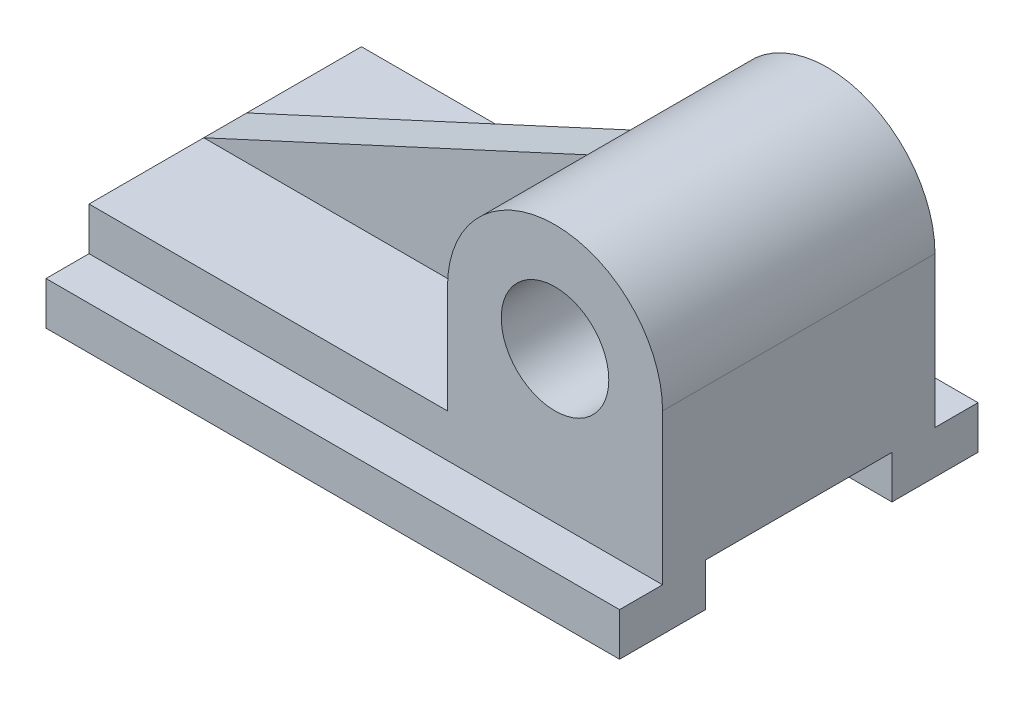
ISO-10303-21;
HEADER;
FILE_DESCRIPTION(('STEP AP214'),'2;1');
FILE_NAME('part.step','',(''),(''),'','','');
FILE_SCHEMA(('AUTOMOTIVE_DESIGN { 1 0 10303 214 1 1 1 1 }'));
ENDSEC;
DATA;
#1=APPLICATION_CONTEXT('core data for automotive mechanical design processes');
#2=APPLICATION_PROTOCOL_DEFINITION('international standard','automotive_design',2000,#1);
#3=PRODUCT_CONTEXT('',#1,'mechanical');
#4=PRODUCT('Part','Part','',(#3));
#5=PRODUCT_RELATED_PRODUCT_CATEGORY('part','',(#4));
#6=PRODUCT_DEFINITION_FORMATION('','',#4);
#7=PRODUCT_DEFINITION_CONTEXT('part definition',#1,'design');
#8=PRODUCT_DEFINITION('design','',#6,#7);
#9=PRODUCT_DEFINITION_SHAPE('','',#8);
#10=(LENGTH_UNIT() NAMED_UNIT(*) SI_UNIT(.MILLI.,.METRE.));
#11=(NAMED_UNIT(*) PLANE_ANGLE_UNIT() SI_UNIT($,.RADIAN.));
#12=(NAMED_UNIT(*) SI_UNIT($,.STERADIAN.) SOLID_ANGLE_UNIT());
#13=UNCERTAINTY_MEASURE_WITH_UNIT(LENGTH_MEASURE(1.E-05),#10,'distance_accuracy_value','');
#14=(GEOMETRIC_REPRESENTATION_CONTEXT(3) GLOBAL_UNCERTAINTY_ASSIGNED_CONTEXT((#13)) GLOBAL_UNIT_ASSIGNED_CONTEXT((#10,
#11,#12)) REPRESENTATION_CONTEXT('',''));
#15=CARTESIAN_POINT('',(0.,0.,0.));
#16=DIRECTION('',(0.,0.,1.));
#17=DIRECTION('',(1.,0.,0.));
#18=AXIS2_PLACEMENT_3D('',#15,#16,#17);
#19=CARTESIAN_POINT('',(-30.,0.,76.));
#20=DIRECTION('',(1.,0.,0.));
#21=DIRECTION('',(0.,1.,0.));
#22=AXIS2_PLACEMENT_3D('',#19,#20,#21);
#23=PLANE('',#22);
#24=DIRECTION('',(0.,-1.,0.));
#25=VECTOR('',#24,1.);
#26=CARTESIAN_POINT('',(-30.,0.,32.));
#27=LINE('',#26,#25);
#28=CARTESIAN_POINT('',(-30.,0.,32.));
#29=VERTEX_POINT('',#28);
#30=CARTESIAN_POINT('',(-30.,-30.,32.));
#31=VERTEX_POINT('',#30);
#32=EDGE_CURVE('E188',#29,#31,#27,.T.);
#33=ORIENTED_EDGE('',*,*,#32,.F.);
#34=DIRECTION('',(0.,0.,-1.));
#35=VECTOR('',#34,1.);
#36=CARTESIAN_POINT('',(-30.,0.,76.));
#37=LINE('',#36,#35);
#38=CARTESIAN_POINT('',(-30.,0.,0.));
#39=VERTEX_POINT('',#38);
#40=EDGE_CURVE('E48',#29,#39,#37,.T.);
#41=ORIENTED_EDGE('',*,*,#40,.T.);
#42=DIRECTION('',(0.,-1.,0.));
#43=VECTOR('',#42,1.);
#44=CARTESIAN_POINT('',(-30.,0.,0.));
#45=LINE('',#44,#43);
#46=CARTESIAN_POINT('',(-30.,-30.,0.));
#47=VERTEX_POINT('',#46);
#48=EDGE_CURVE('E322',#39,#47,#45,.T.);
#49=ORIENTED_EDGE('',*,*,#48,.T.);
#50=DIRECTION('',(0.,0.,-1.));
#51=VECTOR('',#50,1.);
#52=CARTESIAN_POINT('',(-30.,-30.,76.));
#53=LINE('',#52,#51);
#54=EDGE_CURVE('E353',#31,#47,#53,.T.);
#55=ORIENTED_EDGE('',*,*,#54,.F.);
#56=EDGE_LOOP('',(#33,#41,#49,#55));
#57=FACE_BOUND('',#56,.T.);
#58=ADVANCED_FACE('F39',(#57),#23,.F.);
#59=CARTESIAN_POINT('',(-30.,-30.,76.));
#60=DIRECTION('',(0.,-1.,0.));
#61=DIRECTION('',(0.,0.,-1.));
#62=AXIS2_PLACEMENT_3D('',#59,#60,#61);
#63=PLANE('',#62);
#64=DIRECTION('',(-1.,0.,0.));
#65=VECTOR('',#64,1.);
#66=CARTESIAN_POINT('',(-30.,-30.,32.));
#67=LINE('',#66,#65);
#68=CARTESIAN_POINT('',(-130.,-30.,32.));
#69=VERTEX_POINT('',#68);
#70=EDGE_CURVE('E180',#31,#69,#67,.T.);
#71=ORIENTED_EDGE('',*,*,#70,.F.);
#72=ORIENTED_EDGE('',*,*,#54,.T.);
#73=DIRECTION('',(-1.,0.,0.));
#74=VECTOR('',#73,1.);
#75=CARTESIAN_POINT('',(-30.,-30.,0.));
#76=LINE('',#75,#74);
#77=CARTESIAN_POINT('',(-130.,-30.,0.));
#78=VERTEX_POINT('',#77);
#79=EDGE_CURVE('E326',#47,#78,#76,.T.);
#80=ORIENTED_EDGE('',*,*,#79,.T.);
#81=DIRECTION('',(0.,0.,-1.));
#82=VECTOR('',#81,1.);
#83=CARTESIAN_POINT('',(-130.,-30.,76.));
#84=LINE('',#83,#82);
#85=EDGE_CURVE('E349',#69,#78,#84,.T.);
#86=ORIENTED_EDGE('',*,*,#85,.F.);
#87=EDGE_LOOP('',(#71,#72,#80,#86));
#88=FACE_BOUND('',#87,.T.);
#89=ADVANCED_FACE('F365',(#88),#63,.F.);
#90=CARTESIAN_POINT('',(30.,-42.,76.));
#91=DIRECTION('',(0.,1.,0.));
#92=DIRECTION('',(-1.,0.,0.));
#93=AXIS2_PLACEMENT_3D('',#90,#91,#92);
#94=PLANE('',#93);
#95=DIRECTION('',(0.,0.,-1.));
#96=VECTOR('',#95,1.);
#97=CARTESIAN_POINT('',(-130.,-42.,76.));
#98=LINE('',#97,#96);
#99=CARTESIAN_POINT('',(-130.,-42.,64.));
#100=VERTEX_POINT('',#99);
#101=CARTESIAN_POINT('',(-130.,-42.,12.));
#102=VERTEX_POINT('',#101);
#103=EDGE_CURVE('E346',#100,#102,#98,.T.);
#104=ORIENTED_EDGE('',*,*,#103,.T.);
#105=DIRECTION('',(1.,0.,0.));
#106=VECTOR('',#105,1.);
#107=CARTESIAN_POINT('',(-130.,-42.,12.));
#108=LINE('',#107,#106);
#109=CARTESIAN_POINT('',(30.,-42.,12.));
#110=VERTEX_POINT('',#109);
#111=EDGE_CURVE('E210',#102,#110,#108,.T.);
#112=ORIENTED_EDGE('',*,*,#111,.T.);
#113=DIRECTION('',(0.,0.,-1.));
#114=VECTOR('',#113,1.);
#115=CARTESIAN_POINT('',(30.,-42.,76.));
#116=LINE('',#115,#114);
#117=CARTESIAN_POINT('',(30.,-42.,64.));
#118=VERTEX_POINT('',#117);
#119=EDGE_CURVE('E343',#118,#110,#116,.T.);
#120=ORIENTED_EDGE('',*,*,#119,.F.);
#121=DIRECTION('',(1.,0.,0.));
#122=VECTOR('',#121,1.);
#123=CARTESIAN_POINT('',(-130.,-42.,64.));
#124=LINE('',#123,#122);
#125=EDGE_CURVE('E63',#100,#118,#124,.T.);
#126=ORIENTED_EDGE('',*,*,#125,.F.);
#127=EDGE_LOOP('',(#104,#112,#120,#126));
#128=FACE_BOUND('',#127,.T.);
#129=ADVANCED_FACE('F415',(#128),#94,.F.);
#130=CARTESIAN_POINT('',(0.,0.,76.));
#131=DIRECTION('',(0.,0.,1.));
#132=DIRECTION('',(1.,0.,0.));
#133=AXIS2_PLACEMENT_3D('',#130,#131,#132);
#134=PLANE('',#133);
#135=CARTESIAN_POINT('',(0.,0.,76.));
#136=DIRECTION('',(0.,0.,1.));
#137=DIRECTION('',(1.,0.,0.));
#138=AXIS2_PLACEMENT_3D('',#135,#136,#137);
#139=CIRCLE('',#138,30.);
#140=CARTESIAN_POINT('',(30.,0.,76.));
#141=VERTEX_POINT('',#140);
#142=CARTESIAN_POINT('',(-30.,0.,76.));
#143=VERTEX_POINT('',#142);
#144=EDGE_CURVE('E299',#141,#143,#139,.T.);
#145=ORIENTED_EDGE('',*,*,#144,.T.);
#146=DIRECTION('',(0.,-1.,0.));
#147=VECTOR('',#146,1.);
#148=CARTESIAN_POINT('',(-30.,0.,76.));
#149=LINE('',#148,#147);
#150=CARTESIAN_POINT('',(-30.,-30.,76.));
#151=VERTEX_POINT('',#150);
#152=EDGE_CURVE('E303',#143,#151,#149,.T.);
#153=ORIENTED_EDGE('',*,*,#152,.T.);
#154=DIRECTION('',(-1.,0.,0.));
#155=VECTOR('',#154,1.);
#156=CARTESIAN_POINT('',(-30.,-30.,76.));
#157=LINE('',#156,#155);
#158=CARTESIAN_POINT('',(-130.,-30.,76.));
#159=VERTEX_POINT('',#158);
#160=EDGE_CURVE('E307',#151,#159,#157,.T.);
#161=ORIENTED_EDGE('',*,*,#160,.T.);
#162=DIRECTION('',(0.,-1.,0.));
#163=VECTOR('',#162,1.);
#164=CARTESIAN_POINT('',(-130.,-42.,76.));
#165=LINE('',#164,#163);
#166=CARTESIAN_POINT('',(-130.,-42.,76.));
#167=VERTEX_POINT('',#166);
#168=EDGE_CURVE('E310',#159,#167,#165,.T.);
#169=ORIENTED_EDGE('',*,*,#168,.T.);
#170=DIRECTION('',(1.,0.,0.));
#171=VECTOR('',#170,1.);
#172=CARTESIAN_POINT('',(30.,-42.,76.));
#173=LINE('',#172,#171);
#174=CARTESIAN_POINT('',(30.,-42.,76.));
#175=VERTEX_POINT('',#174);
#176=EDGE_CURVE('E313',#167,#175,#173,.T.);
#177=ORIENTED_EDGE('',*,*,#176,.T.);
#178=DIRECTION('',(0.,1.,0.));
#179=VECTOR('',#178,1.);
#180=CARTESIAN_POINT('',(30.,0.,76.));
#181=LINE('',#180,#179);
#182=EDGE_CURVE('E316',#175,#141,#181,.T.);
#183=ORIENTED_EDGE('',*,*,#182,.T.);
#184=EDGE_LOOP('',(#145,#153,#161,#169,#177,#183));
#185=FACE_BOUND('',#184,.T.);
#186=CARTESIAN_POINT('',(0.,0.,76.));
#187=DIRECTION('',(0.,0.,1.));
#188=DIRECTION('',(1.,0.,0.));
#189=AXIS2_PLACEMENT_3D('',#186,#187,#188);
#190=CIRCLE('',#189,15.);
#191=CARTESIAN_POINT('',(15.,0.,76.));
#192=VERTEX_POINT('',#191);
#193=EDGE_CURVE('E291',#192,#192,#190,.T.);
#194=ORIENTED_EDGE('',*,*,#193,.F.);
#195=EDGE_LOOP('',(#194));
#196=FACE_BOUND('',#195,.T.);
#197=ADVANCED_FACE('F391',(#185,#196),#134,.T.);
#198=CARTESIAN_POINT('',(0.,0.,0.));
#199=DIRECTION('',(0.,0.,1.));
#200=DIRECTION('',(1.,0.,0.));
#201=AXIS2_PLACEMENT_3D('',#198,#199,#200);
#202=PLANE('',#201);
#203=CARTESIAN_POINT('',(0.,0.,0.));
#204=DIRECTION('',(0.,0.,1.));
#205=DIRECTION('',(1.,0.,0.));
#206=AXIS2_PLACEMENT_3D('',#203,#204,#205);
#207=CIRCLE('',#206,30.);
#208=CARTESIAN_POINT('',(30.,0.,0.));
#209=VERTEX_POINT('',#208);
#210=EDGE_CURVE('E295',#209,#39,#207,.T.);
#211=ORIENTED_EDGE('',*,*,#210,.F.);
#212=DIRECTION('',(0.,1.,0.));
#213=VECTOR('',#212,1.);
#214=CARTESIAN_POINT('',(30.,0.,0.));
#215=LINE('',#214,#213);
#216=CARTESIAN_POINT('',(30.,-42.,0.));
#217=VERTEX_POINT('',#216);
#218=EDGE_CURVE('E304',#217,#209,#215,.T.);
#219=ORIENTED_EDGE('',*,*,#218,.F.);
#220=DIRECTION('',(1.,0.,0.));
#221=VECTOR('',#220,1.);
#222=CARTESIAN_POINT('',(30.,-42.,0.));
#223=LINE('',#222,#221);
#224=CARTESIAN_POINT('',(-130.,-42.,0.));
#225=VERTEX_POINT('',#224);
#226=EDGE_CURVE('E334',#225,#217,#223,.T.);
#227=ORIENTED_EDGE('',*,*,#226,.F.);
#228=DIRECTION('',(0.,-1.,0.));
#229=VECTOR('',#228,1.);
#230=CARTESIAN_POINT('',(-130.,-42.,0.));
#231=LINE('',#230,#229);
#232=EDGE_CURVE('E330',#78,#225,#231,.T.);
#233=ORIENTED_EDGE('',*,*,#232,.F.);
#234=ORIENTED_EDGE('',*,*,#79,.F.);
#235=ORIENTED_EDGE('',*,*,#48,.F.);
#236=EDGE_LOOP('',(#211,#219,#227,#233,#234,#235));
#237=FACE_BOUND('',#236,.T.);
#238=CARTESIAN_POINT('',(0.,0.,0.));
#239=DIRECTION('',(0.,0.,1.));
#240=DIRECTION('',(1.,0.,0.));
#241=AXIS2_PLACEMENT_3D('',#238,#239,#240);
#242=CIRCLE('',#241,15.);
#243=CARTESIAN_POINT('',(15.,0.,0.));
#244=VERTEX_POINT('',#243);
#245=EDGE_CURVE('E290',#244,#244,#242,.T.);
#246=ORIENTED_EDGE('',*,*,#245,.T.);
#247=EDGE_LOOP('',(#246));
#248=FACE_BOUND('',#247,.T.);
#249=ADVANCED_FACE('F372',(#237,#248),#202,.F.);
#250=CARTESIAN_POINT('',(0.,0.,76.));
#251=DIRECTION('',(0.,0.,-1.));
#252=DIRECTION('',(-1.,0.,0.));
#253=AXIS2_PLACEMENT_3D('',#250,#251,#252);
#254=CYLINDRICAL_SURFACE('',#253,30.);
#255=DIRECTION('',(0.,0.,-1.));
#256=VECTOR('',#255,1.);
#257=CARTESIAN_POINT('',(-22.8292682926829,19.4634146341463,76.));
#258=LINE('',#257,#256);
#259=CARTESIAN_POINT('',(-22.8292682926829,19.4634146341463,32.));
#260=VERTEX_POINT('',#259);
#261=CARTESIAN_POINT('',(-22.8292682926829,19.4634146341463,44.));
#262=VERTEX_POINT('',#261);
#263=EDGE_CURVE('E164',#260,#262,#258,.F.);
#264=ORIENTED_EDGE('',*,*,#263,.T.);
#265=CARTESIAN_POINT('',(0.,0.,44.));
#266=DIRECTION('',(0.,0.,1.));
#267=DIRECTION('',(1.,0.,0.));
#268=AXIS2_PLACEMENT_3D('',#265,#266,#267);
#269=CIRCLE('',#268,30.);
#270=CARTESIAN_POINT('',(-30.,0.,44.));
#271=VERTEX_POINT('',#270);
#272=EDGE_CURVE('E173',#262,#271,#269,.T.);
#273=ORIENTED_EDGE('',*,*,#272,.T.);
#274=EDGE_CURVE('E11',#143,#271,#37,.T.);
#275=ORIENTED_EDGE('',*,*,#274,.F.);
#276=ORIENTED_EDGE('',*,*,#144,.F.);
#277=DIRECTION('',(0.,0.,-1.));
#278=VECTOR('',#277,1.);
#279=CARTESIAN_POINT('',(30.,0.,76.));
#280=LINE('',#279,#278);
#281=EDGE_CURVE('E319',#141,#209,#280,.T.);
#282=ORIENTED_EDGE('',*,*,#281,.T.);
#283=ORIENTED_EDGE('',*,*,#210,.T.);
#284=ORIENTED_EDGE('',*,*,#40,.F.);
#285=CARTESIAN_POINT('',(0.,0.,32.));
#286=DIRECTION('',(0.,0.,1.));
#287=DIRECTION('',(1.,0.,0.));
#288=AXIS2_PLACEMENT_3D('',#285,#286,#287);
#289=CIRCLE('',#288,30.);
#290=EDGE_CURVE('E177',#260,#29,#289,.T.);
#291=ORIENTED_EDGE('',*,*,#290,.F.);
#292=EDGE_LOOP('',(#264,#273,#275,#276,#282,#283,#284,#291));
#293=FACE_BOUND('',#292,.T.);
#294=ADVANCED_FACE('F41',(#293),#254,.T.);
#295=ORIENTED_EDGE('',*,*,#274,.T.);
#296=DIRECTION('',(0.,-1.,0.));
#297=VECTOR('',#296,1.);
#298=CARTESIAN_POINT('',(-30.,0.,44.));
#299=LINE('',#298,#297);
#300=CARTESIAN_POINT('',(-30.,-30.,44.));
#301=VERTEX_POINT('',#300);
#302=EDGE_CURVE('E193',#271,#301,#299,.T.);
#303=ORIENTED_EDGE('',*,*,#302,.T.);
#304=EDGE_CURVE('E355',#151,#301,#53,.T.);
#305=ORIENTED_EDGE('',*,*,#304,.F.);
#306=ORIENTED_EDGE('',*,*,#152,.F.);
#307=EDGE_LOOP('',(#295,#303,#305,#306));
#308=FACE_BOUND('',#307,.T.);
#309=ADVANCED_FACE('F432',(#308),#23,.F.);
#310=ORIENTED_EDGE('',*,*,#304,.T.);
#311=DIRECTION('',(-1.,0.,0.));
#312=VECTOR('',#311,1.);
#313=CARTESIAN_POINT('',(-30.,-30.,44.));
#314=LINE('',#313,#312);
#315=CARTESIAN_POINT('',(-130.,-30.,44.));
#316=VERTEX_POINT('',#315);
#317=EDGE_CURVE('E187',#301,#316,#314,.T.);
#318=ORIENTED_EDGE('',*,*,#317,.T.);
#319=EDGE_CURVE('E350',#159,#316,#84,.T.);
#320=ORIENTED_EDGE('',*,*,#319,.F.);
#321=ORIENTED_EDGE('',*,*,#160,.F.);
#322=EDGE_LOOP('',(#310,#318,#320,#321));
#323=FACE_BOUND('',#322,.T.);
#324=ADVANCED_FACE('F387',(#323),#63,.F.);
#325=CARTESIAN_POINT('',(-130.,-42.,76.));
#326=DIRECTION('',(1.,0.,0.));
#327=DIRECTION('',(0.,0.,-1.));
#328=AXIS2_PLACEMENT_3D('',#325,#326,#327);
#329=PLANE('',#328);
#330=ORIENTED_EDGE('',*,*,#319,.T.);
#331=EDGE_CURVE('E354',#316,#69,#84,.T.);
#332=ORIENTED_EDGE('',*,*,#331,.T.);
#333=ORIENTED_EDGE('',*,*,#85,.T.);
#334=ORIENTED_EDGE('',*,*,#232,.T.);
#335=DIRECTION('',(0.,0.,1.));
#336=VECTOR('',#335,1.);
#337=CARTESIAN_POINT('',(-130.,-42.,12.));
#338=LINE('',#337,#336);
#339=CARTESIAN_POINT('',(-130.,-42.,-12.));
#340=VERTEX_POINT('',#339);
#341=EDGE_CURVE('E172',#340,#225,#338,.T.);
#342=ORIENTED_EDGE('',*,*,#341,.F.);
#343=DIRECTION('',(0.,1.,0.));
#344=VECTOR('',#343,1.);
#345=CARTESIAN_POINT('',(-130.,-54.,-12.));
#346=LINE('',#345,#344);
#347=CARTESIAN_POINT('',(-130.,-54.,-12.));
#348=VERTEX_POINT('',#347);
#349=EDGE_CURVE('E246',#348,#340,#346,.T.);
#350=ORIENTED_EDGE('',*,*,#349,.F.);
#351=DIRECTION('',(0.,0.,1.));
#352=VECTOR('',#351,1.);
#353=CARTESIAN_POINT('',(-130.,-54.,12.));
#354=LINE('',#353,#352);
#355=CARTESIAN_POINT('',(-130.,-54.,12.));
#356=VERTEX_POINT('',#355);
#357=EDGE_CURVE('E205',#348,#356,#354,.T.);
#358=ORIENTED_EDGE('',*,*,#357,.T.);
#359=DIRECTION('',(0.,1.,0.));
#360=VECTOR('',#359,1.);
#361=CARTESIAN_POINT('',(-130.,-54.,12.));
#362=LINE('',#361,#360);
#363=EDGE_CURVE('E222',#356,#102,#362,.T.);
#364=ORIENTED_EDGE('',*,*,#363,.T.);
#365=ORIENTED_EDGE('',*,*,#103,.F.);
#366=DIRECTION('',(0.,1.,0.));
#367=VECTOR('',#366,1.);
#368=CARTESIAN_POINT('',(-130.,-54.,64.));
#369=LINE('',#368,#367);
#370=CARTESIAN_POINT('',(-130.,-54.,64.));
#371=VERTEX_POINT('',#370);
#372=EDGE_CURVE('E286',#371,#100,#369,.T.);
#373=ORIENTED_EDGE('',*,*,#372,.F.);
#374=DIRECTION('',(0.,0.,-1.));
#375=VECTOR('',#374,1.);
#376=CARTESIAN_POINT('',(-130.,-54.,64.));
#377=LINE('',#376,#375);
#378=CARTESIAN_POINT('',(-130.,-54.,88.));
#379=VERTEX_POINT('',#378);
#380=EDGE_CURVE('E250',#379,#371,#377,.T.);
#381=ORIENTED_EDGE('',*,*,#380,.F.);
#382=DIRECTION('',(0.,1.,0.));
#383=VECTOR('',#382,1.);
#384=CARTESIAN_POINT('',(-130.,-54.,88.));
#385=LINE('',#384,#383);
#386=CARTESIAN_POINT('',(-130.,-42.,88.));
#387=VERTEX_POINT('',#386);
#388=EDGE_CURVE('E264',#379,#387,#385,.T.);
#389=ORIENTED_EDGE('',*,*,#388,.T.);
#390=DIRECTION('',(0.,0.,-1.));
#391=VECTOR('',#390,1.);
#392=CARTESIAN_POINT('',(-130.,-42.,64.));
#393=LINE('',#392,#391);
#394=EDGE_CURVE('E249',#387,#167,#393,.T.);
#395=ORIENTED_EDGE('',*,*,#394,.T.);
#396=ORIENTED_EDGE('',*,*,#168,.F.);
#397=EDGE_LOOP('',(#330,#332,#333,#334,#342,#350,#358,#364,#365,#373,#381,#389,#395,#396));
#398=FACE_BOUND('',#397,.T.);
#399=ADVANCED_FACE('F378',(#398),#329,.F.);
#400=CARTESIAN_POINT('',(30.,0.,76.));
#401=DIRECTION('',(-1.,0.,0.));
#402=DIRECTION('',(0.,-1.,0.));
#403=AXIS2_PLACEMENT_3D('',#400,#401,#402);
#404=PLANE('',#403);
#405=ORIENTED_EDGE('',*,*,#119,.T.);
#406=DIRECTION('',(0.,1.,0.));
#407=VECTOR('',#406,1.);
#408=CARTESIAN_POINT('',(30.,-54.,12.));
#409=LINE('',#408,#407);
#410=CARTESIAN_POINT('',(30.,-54.,12.));
#411=VERTEX_POINT('',#410);
#412=EDGE_CURVE('E238',#411,#110,#409,.T.);
#413=ORIENTED_EDGE('',*,*,#412,.F.);
#414=DIRECTION('',(0.,0.,-1.));
#415=VECTOR('',#414,1.);
#416=CARTESIAN_POINT('',(30.,-54.,12.));
#417=LINE('',#416,#415);
#418=CARTESIAN_POINT('',(30.,-54.,-12.));
#419=VERTEX_POINT('',#418);
#420=EDGE_CURVE('E214',#411,#419,#417,.T.);
#421=ORIENTED_EDGE('',*,*,#420,.T.);
#422=DIRECTION('',(0.,1.,0.));
#423=VECTOR('',#422,1.);
#424=CARTESIAN_POINT('',(30.,-54.,-12.));
#425=LINE('',#424,#423);
#426=CARTESIAN_POINT('',(30.,-42.,-12.));
#427=VERTEX_POINT('',#426);
#428=EDGE_CURVE('E242',#419,#427,#425,.T.);
#429=ORIENTED_EDGE('',*,*,#428,.T.);
#430=DIRECTION('',(0.,0.,-1.));
#431=VECTOR('',#430,1.);
#432=CARTESIAN_POINT('',(30.,-42.,12.));
#433=LINE('',#432,#431);
#434=EDGE_CURVE('E229',#217,#427,#433,.T.);
#435=ORIENTED_EDGE('',*,*,#434,.F.);
#436=ORIENTED_EDGE('',*,*,#218,.T.);
#437=ORIENTED_EDGE('',*,*,#281,.F.);
#438=ORIENTED_EDGE('',*,*,#182,.F.);
#439=DIRECTION('',(0.,0.,1.));
#440=VECTOR('',#439,1.);
#441=CARTESIAN_POINT('',(30.,-42.,64.));
#442=LINE('',#441,#440);
#443=CARTESIAN_POINT('',(30.,-42.,88.));
#444=VERTEX_POINT('',#443);
#445=EDGE_CURVE('E270',#175,#444,#442,.T.);
#446=ORIENTED_EDGE('',*,*,#445,.T.);
#447=DIRECTION('',(0.,1.,0.));
#448=VECTOR('',#447,1.);
#449=CARTESIAN_POINT('',(30.,-54.,88.));
#450=LINE('',#449,#448);
#451=CARTESIAN_POINT('',(30.,-54.,88.));
#452=VERTEX_POINT('',#451);
#453=EDGE_CURVE('E278',#452,#444,#450,.T.);
#454=ORIENTED_EDGE('',*,*,#453,.F.);
#455=DIRECTION('',(0.,0.,1.));
#456=VECTOR('',#455,1.);
#457=CARTESIAN_POINT('',(30.,-54.,64.));
#458=LINE('',#457,#456);
#459=CARTESIAN_POINT('',(30.,-54.,64.));
#460=VERTEX_POINT('',#459);
#461=EDGE_CURVE('E258',#460,#452,#458,.T.);
#462=ORIENTED_EDGE('',*,*,#461,.F.);
#463=DIRECTION('',(0.,1.,0.));
#464=VECTOR('',#463,1.);
#465=CARTESIAN_POINT('',(30.,-54.,64.));
#466=LINE('',#465,#464);
#467=EDGE_CURVE('E282',#460,#118,#466,.T.);
#468=ORIENTED_EDGE('',*,*,#467,.T.);
#469=EDGE_LOOP('',(#405,#413,#421,#429,#435,#436,#437,#438,#446,#454,#462,#468));
#470=FACE_BOUND('',#469,.T.);
#471=ADVANCED_FACE('F400',(#470),#404,.F.);
#472=CARTESIAN_POINT('',(0.,0.,76.));
#473=DIRECTION('',(0.,0.,-1.));
#474=DIRECTION('',(-1.,0.,0.));
#475=AXIS2_PLACEMENT_3D('',#472,#473,#474);
#476=CYLINDRICAL_SURFACE('',#475,15.);
#477=ORIENTED_EDGE('',*,*,#193,.T.);
#478=EDGE_LOOP('',(#477));
#479=FACE_BOUND('',#478,.T.);
#480=ORIENTED_EDGE('',*,*,#245,.F.);
#481=EDGE_LOOP('',(#480));
#482=FACE_BOUND('',#481,.T.);
#483=ADVANCED_FACE('F452',(#479,#482),#476,.F.);
#484=CARTESIAN_POINT('',(0.,-42.,0.));
#485=DIRECTION('',(0.,1.,0.));
#486=DIRECTION('',(-1.,0.,0.));
#487=AXIS2_PLACEMENT_3D('',#484,#485,#486);
#488=PLANE('',#487);
#489=ORIENTED_EDGE('',*,*,#176,.F.);
#490=ORIENTED_EDGE('',*,*,#394,.F.);
#491=DIRECTION('',(-1.,0.,0.));
#492=VECTOR('',#491,1.);
#493=CARTESIAN_POINT('',(-130.,-42.,88.));
#494=LINE('',#493,#492);
#495=EDGE_CURVE('E255',#444,#387,#494,.T.);
#496=ORIENTED_EDGE('',*,*,#495,.F.);
#497=ORIENTED_EDGE('',*,*,#445,.F.);
#498=EDGE_LOOP('',(#489,#490,#496,#497));
#499=FACE_BOUND('',#498,.T.);
#500=ADVANCED_FACE('F396',(#499),#488,.T.);
#501=CARTESIAN_POINT('',(-130.,-54.,64.));
#502=DIRECTION('',(0.,0.,1.));
#503=DIRECTION('',(1.,0.,0.));
#504=AXIS2_PLACEMENT_3D('',#501,#502,#503);
#505=PLANE('',#504);
#506=ORIENTED_EDGE('',*,*,#125,.T.);
#507=ORIENTED_EDGE('',*,*,#467,.F.);
#508=DIRECTION('',(1.,0.,0.));
#509=VECTOR('',#508,1.);
#510=CARTESIAN_POINT('',(-130.,-54.,64.));
#511=LINE('',#510,#509);
#512=EDGE_CURVE('E254',#371,#460,#511,.T.);
#513=ORIENTED_EDGE('',*,*,#512,.F.);
#514=ORIENTED_EDGE('',*,*,#372,.T.);
#515=EDGE_LOOP('',(#506,#507,#513,#514));
#516=FACE_BOUND('',#515,.T.);
#517=ADVANCED_FACE('F413',(#516),#505,.F.);
#518=CARTESIAN_POINT('',(-130.,-54.,88.));
#519=DIRECTION('',(0.,0.,-1.));
#520=DIRECTION('',(-1.,0.,0.));
#521=AXIS2_PLACEMENT_3D('',#518,#519,#520);
#522=PLANE('',#521);
#523=ORIENTED_EDGE('',*,*,#495,.T.);
#524=ORIENTED_EDGE('',*,*,#388,.F.);
#525=DIRECTION('',(-1.,0.,0.));
#526=VECTOR('',#525,1.);
#527=CARTESIAN_POINT('',(-130.,-54.,88.));
#528=LINE('',#527,#526);
#529=EDGE_CURVE('E261',#452,#379,#528,.T.);
#530=ORIENTED_EDGE('',*,*,#529,.F.);
#531=ORIENTED_EDGE('',*,*,#453,.T.);
#532=EDGE_LOOP('',(#523,#524,#530,#531));
#533=FACE_BOUND('',#532,.T.);
#534=ADVANCED_FACE('F405',(#533),#522,.F.);
#535=CARTESIAN_POINT('',(0.,-54.,0.));
#536=DIRECTION('',(0.,1.,0.));
#537=DIRECTION('',(-1.,0.,0.));
#538=AXIS2_PLACEMENT_3D('',#535,#536,#537);
#539=PLANE('',#538);
#540=ORIENTED_EDGE('',*,*,#380,.T.);
#541=ORIENTED_EDGE('',*,*,#512,.T.);
#542=ORIENTED_EDGE('',*,*,#461,.T.);
#543=ORIENTED_EDGE('',*,*,#529,.T.);
#544=EDGE_LOOP('',(#540,#541,#542,#543));
#545=FACE_BOUND('',#544,.T.);
#546=ADVANCED_FACE('F409',(#545),#539,.F.);
#547=CARTESIAN_POINT('',(0.,-42.,76.));
#548=DIRECTION('',(0.,1.,0.));
#549=DIRECTION('',(-1.,0.,0.));
#550=AXIS2_PLACEMENT_3D('',#547,#548,#549);
#551=PLANE('',#550);
#552=ORIENTED_EDGE('',*,*,#226,.T.);
#553=ORIENTED_EDGE('',*,*,#434,.T.);
#554=DIRECTION('',(-1.,0.,0.));
#555=VECTOR('',#554,1.);
#556=CARTESIAN_POINT('',(-130.,-42.,-12.));
#557=LINE('',#556,#555);
#558=EDGE_CURVE('E225',#427,#340,#557,.T.);
#559=ORIENTED_EDGE('',*,*,#558,.T.);
#560=ORIENTED_EDGE('',*,*,#341,.T.);
#561=EDGE_LOOP('',(#552,#553,#559,#560));
#562=FACE_BOUND('',#561,.T.);
#563=ADVANCED_FACE('F428',(#562),#551,.T.);
#564=CARTESIAN_POINT('',(-130.,-54.,-12.));
#565=DIRECTION('',(0.,0.,-1.));
#566=DIRECTION('',(-1.,0.,0.));
#567=AXIS2_PLACEMENT_3D('',#564,#565,#566);
#568=PLANE('',#567);
#569=ORIENTED_EDGE('',*,*,#558,.F.);
#570=ORIENTED_EDGE('',*,*,#428,.F.);
#571=DIRECTION('',(-1.,0.,0.));
#572=VECTOR('',#571,1.);
#573=CARTESIAN_POINT('',(-130.,-54.,-12.));
#574=LINE('',#573,#572);
#575=EDGE_CURVE('E209',#419,#348,#574,.T.);
#576=ORIENTED_EDGE('',*,*,#575,.T.);
#577=ORIENTED_EDGE('',*,*,#349,.T.);
#578=EDGE_LOOP('',(#569,#570,#576,#577));
#579=FACE_BOUND('',#578,.T.);
#580=ADVANCED_FACE('F426',(#579),#568,.T.);
#581=CARTESIAN_POINT('',(-130.,-54.,12.));
#582=DIRECTION('',(0.,0.,1.));
#583=DIRECTION('',(1.,0.,0.));
#584=AXIS2_PLACEMENT_3D('',#581,#582,#583);
#585=PLANE('',#584);
#586=ORIENTED_EDGE('',*,*,#111,.F.);
#587=ORIENTED_EDGE('',*,*,#363,.F.);
#588=DIRECTION('',(1.,0.,0.));
#589=VECTOR('',#588,1.);
#590=CARTESIAN_POINT('',(-130.,-54.,12.));
#591=LINE('',#590,#589);
#592=EDGE_CURVE('E218',#356,#411,#591,.T.);
#593=ORIENTED_EDGE('',*,*,#592,.T.);
#594=ORIENTED_EDGE('',*,*,#412,.T.);
#595=EDGE_LOOP('',(#586,#587,#593,#594));
#596=FACE_BOUND('',#595,.T.);
#597=ADVANCED_FACE('F417',(#596),#585,.T.);
#598=CARTESIAN_POINT('',(0.,-54.,76.));
#599=DIRECTION('',(0.,1.,0.));
#600=DIRECTION('',(-1.,0.,0.));
#601=AXIS2_PLACEMENT_3D('',#598,#599,#600);
#602=PLANE('',#601);
#603=ORIENTED_EDGE('',*,*,#357,.F.);
#604=ORIENTED_EDGE('',*,*,#575,.F.);
#605=ORIENTED_EDGE('',*,*,#420,.F.);
#606=ORIENTED_EDGE('',*,*,#592,.F.);
#607=EDGE_LOOP('',(#603,#604,#605,#606));
#608=FACE_BOUND('',#607,.T.);
#609=ADVANCED_FACE('F423',(#608),#602,.F.);
#610=CARTESIAN_POINT('',(0.,30.,38.));
#611=DIRECTION('',(0.419058177461747,-0.907959384500452,0.));
#612=DIRECTION('',(0.907959384500452,0.419058177461747,0.));
#613=AXIS2_PLACEMENT_3D('',#610,#611,#612);
#614=PLANE('',#613);
#615=ORIENTED_EDGE('',*,*,#263,.F.);
#616=DIRECTION('',(0.907959384500452,0.419058177461747,0.));
#617=VECTOR('',#616,1.);
#618=CARTESIAN_POINT('',(0.,30.,32.));
#619=LINE('',#618,#617);
#620=EDGE_CURVE('E55',#69,#260,#619,.T.);
#621=ORIENTED_EDGE('',*,*,#620,.F.);
#622=ORIENTED_EDGE('',*,*,#331,.F.);
#623=DIRECTION('',(0.907959384500452,0.419058177461747,0.));
#624=VECTOR('',#623,1.);
#625=CARTESIAN_POINT('',(0.,30.,44.));
#626=LINE('',#625,#624);
#627=EDGE_CURVE('E167',#316,#262,#626,.T.);
#628=ORIENTED_EDGE('',*,*,#627,.T.);
#629=EDGE_LOOP('',(#615,#621,#622,#628));
#630=FACE_BOUND('',#629,.T.);
#631=ADVANCED_FACE('F165',(#630),#614,.F.);
#632=CARTESIAN_POINT('',(-50.,-12.,44.));
#633=DIRECTION('',(0.,0.,1.));
#634=DIRECTION('',(1.,0.,0.));
#635=AXIS2_PLACEMENT_3D('',#632,#633,#634);
#636=PLANE('',#635);
#637=ORIENTED_EDGE('',*,*,#272,.F.);
#638=ORIENTED_EDGE('',*,*,#627,.F.);
#639=ORIENTED_EDGE('',*,*,#317,.F.);
#640=ORIENTED_EDGE('',*,*,#302,.F.);
#641=EDGE_LOOP('',(#637,#638,#639,#640));
#642=FACE_BOUND('',#641,.T.);
#643=ADVANCED_FACE('F385',(#642),#636,.T.);
#644=CARTESIAN_POINT('',(-50.,-12.,32.));
#645=DIRECTION('',(0.,0.,1.));
#646=DIRECTION('',(1.,0.,0.));
#647=AXIS2_PLACEMENT_3D('',#644,#645,#646);
#648=PLANE('',#647);
#649=ORIENTED_EDGE('',*,*,#620,.T.);
#650=ORIENTED_EDGE('',*,*,#290,.T.);
#651=ORIENTED_EDGE('',*,*,#32,.T.);
#652=ORIENTED_EDGE('',*,*,#70,.T.);
#653=EDGE_LOOP('',(#649,#650,#651,#652));
#654=FACE_BOUND('',#653,.T.);
#655=ADVANCED_FACE('F176',(#654),#648,.F.);
#656=CLOSED_SHELL('',(#58,#89,#129,#197,#249,#294,#309,#324,#399,#471,#483,#500,#517,#534,#546,
#563,#580,#597,#609,#631,#643,#655));
#657=MANIFOLD_SOLID_BREP('B2',#656);
#658=ADVANCED_BREP_SHAPE_REPRESENTATION('',(#18,#657),#14);
#659=SHAPE_DEFINITION_REPRESENTATION(#9,#658);
ENDSEC;
END-ISO-10303-21;
